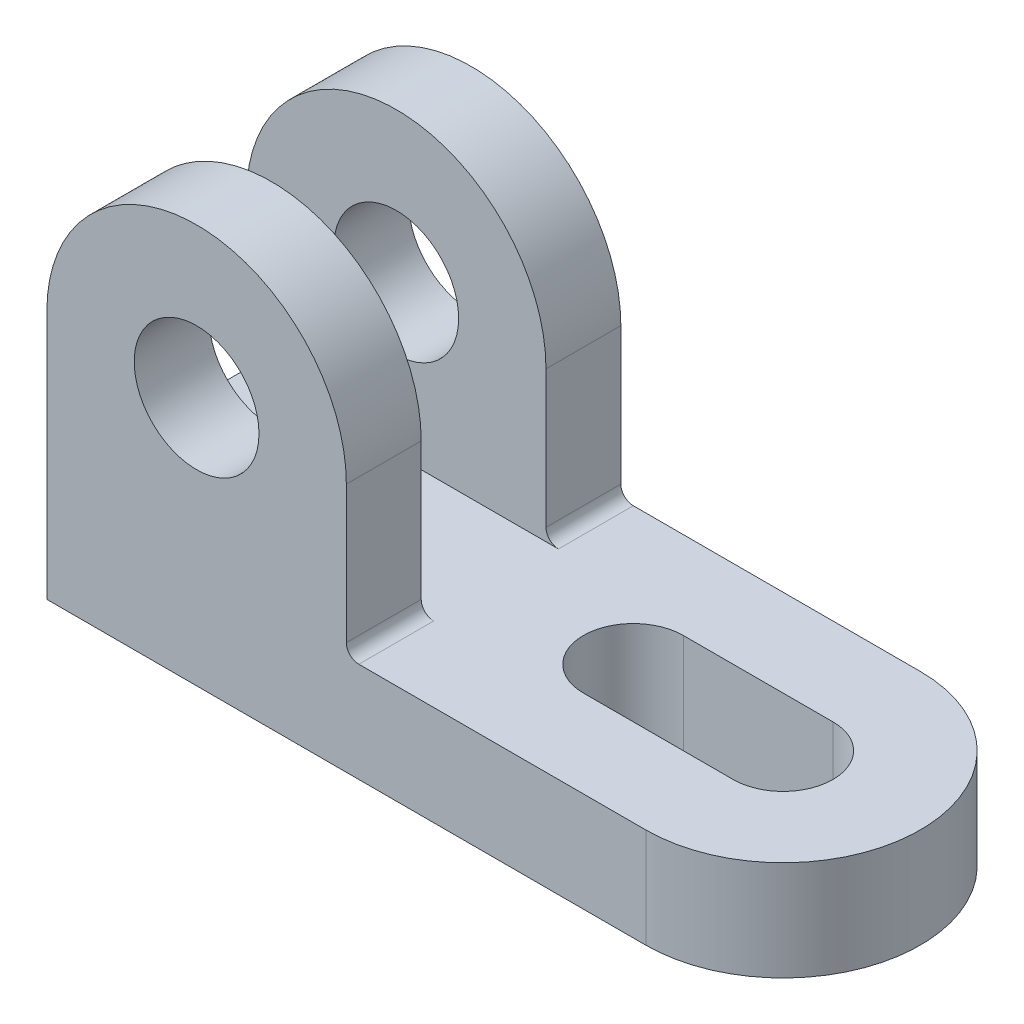
ISO-10303-21;
HEADER;
FILE_DESCRIPTION(('STEP AP214'),'2;1');
FILE_NAME('part.step','',(''),(''),'','','');
FILE_SCHEMA(('AUTOMOTIVE_DESIGN { 1 0 10303 214 1 1 1 1 }'));
ENDSEC;
DATA;
#1=APPLICATION_CONTEXT('core data for automotive mechanical design processes');
#2=APPLICATION_PROTOCOL_DEFINITION('international standard','automotive_design',2000,#1);
#3=PRODUCT_CONTEXT('',#1,'mechanical');
#4=PRODUCT('Part','Part','',(#3));
#5=PRODUCT_RELATED_PRODUCT_CATEGORY('part','',(#4));
#6=PRODUCT_DEFINITION_FORMATION('','',#4);
#7=PRODUCT_DEFINITION_CONTEXT('part definition',#1,'design');
#8=PRODUCT_DEFINITION('design','',#6,#7);
#9=PRODUCT_DEFINITION_SHAPE('','',#8);
#10=(LENGTH_UNIT() NAMED_UNIT(*) SI_UNIT(.MILLI.,.METRE.));
#11=(NAMED_UNIT(*) PLANE_ANGLE_UNIT() SI_UNIT($,.RADIAN.));
#12=(NAMED_UNIT(*) SI_UNIT($,.STERADIAN.) SOLID_ANGLE_UNIT());
#13=UNCERTAINTY_MEASURE_WITH_UNIT(LENGTH_MEASURE(1.E-05),#10,'distance_accuracy_value','');
#14=(GEOMETRIC_REPRESENTATION_CONTEXT(3) GLOBAL_UNCERTAINTY_ASSIGNED_CONTEXT((#13)) GLOBAL_UNIT_ASSIGNED_CONTEXT((#10,
#11,#12)) REPRESENTATION_CONTEXT('',''));
#15=CARTESIAN_POINT('',(0.,0.,0.));
#16=DIRECTION('',(0.,0.,1.));
#17=DIRECTION('',(1.,0.,0.));
#18=AXIS2_PLACEMENT_3D('',#15,#16,#17);
#19=CARTESIAN_POINT('',(0.,16.,0.));
#20=DIRECTION('',(0.,1.,0.));
#21=DIRECTION('',(0.,0.,1.));
#22=AXIS2_PLACEMENT_3D('',#19,#20,#21);
#23=PLANE('',#22);
#24=DIRECTION('',(-1.,0.,0.));
#25=VECTOR('',#24,1.);
#26=CARTESIAN_POINT('',(0.,16.,-7.99999999999996));
#27=LINE('',#26,#25);
#28=CARTESIAN_POINT('',(96.,16.,-8.00000000000001));
#29=VERTEX_POINT('',#28);
#30=CARTESIAN_POINT('',(72.,16.,-8.00000000000001));
#31=VERTEX_POINT('',#30);
#32=EDGE_CURVE('E250',#29,#31,#27,.T.);
#33=ORIENTED_EDGE('',*,*,#32,.F.);
#34=CARTESIAN_POINT('',(96.,16.,-5.06539254985228E-13));
#35=DIRECTION('',(0.,1.,0.));
#36=DIRECTION('',(0.,0.,1.));
#37=AXIS2_PLACEMENT_3D('',#34,#35,#36);
#38=CIRCLE('',#37,8.);
#39=CARTESIAN_POINT('',(96.,16.,7.99999999999998));
#40=VERTEX_POINT('',#39);
#41=EDGE_CURVE('E254',#29,#40,#38,.F.);
#42=ORIENTED_EDGE('',*,*,#41,.T.);
#43=DIRECTION('',(1.,0.,0.));
#44=VECTOR('',#43,1.);
#45=CARTESIAN_POINT('',(0.,16.,7.99999999999998));
#46=LINE('',#45,#44);
#47=CARTESIAN_POINT('',(72.,16.,7.99999999999998));
#48=VERTEX_POINT('',#47);
#49=EDGE_CURVE('E258',#48,#40,#46,.T.);
#50=ORIENTED_EDGE('',*,*,#49,.F.);
#51=CARTESIAN_POINT('',(72.,16.,0.));
#52=DIRECTION('',(0.,1.,0.));
#53=DIRECTION('',(0.,0.,1.));
#54=AXIS2_PLACEMENT_3D('',#51,#52,#53);
#55=CIRCLE('',#54,7.99999999999999);
#56=EDGE_CURVE('E262',#31,#48,#55,.T.);
#57=ORIENTED_EDGE('',*,*,#56,.F.);
#58=EDGE_LOOP('',(#33,#42,#50,#57));
#59=FACE_BOUND('',#58,.T.);
#60=DIRECTION('',(1.,0.,0.));
#61=VECTOR('',#60,1.);
#62=CARTESIAN_POINT('',(-2.29778580422095E-13,16.,-22.));
#63=LINE('',#62,#61);
#64=CARTESIAN_POINT('',(50.,16.,-22.0000000000005));
#65=VERTEX_POINT('',#64);
#66=CARTESIAN_POINT('',(96.,16.,-22.000000000001));
#67=VERTEX_POINT('',#66);
#68=EDGE_CURVE('E270',#65,#67,#63,.T.);
#69=ORIENTED_EDGE('',*,*,#68,.F.);
#70=DIRECTION('',(0.,0.,1.));
#71=VECTOR('',#70,1.);
#72=CARTESIAN_POINT('',(50.,16.,0.));
#73=LINE('',#72,#71);
#74=CARTESIAN_POINT('',(50.,16.,-10.));
#75=VERTEX_POINT('',#74);
#76=EDGE_CURVE('E335',#65,#75,#73,.T.);
#77=ORIENTED_EDGE('',*,*,#76,.T.);
#78=DIRECTION('',(1.,0.,0.));
#79=VECTOR('',#78,1.);
#80=CARTESIAN_POINT('',(0.,16.,-10.));
#81=LINE('',#80,#79);
#82=CARTESIAN_POINT('',(0.,16.,-10.));
#83=VERTEX_POINT('',#82);
#84=EDGE_CURVE('E209',#83,#75,#81,.T.);
#85=ORIENTED_EDGE('',*,*,#84,.F.);
#86=DIRECTION('',(0.,0.,-1.));
#87=VECTOR('',#86,1.);
#88=CARTESIAN_POINT('',(0.,16.,0.));
#89=LINE('',#88,#87);
#90=CARTESIAN_POINT('',(0.,16.,10.));
#91=VERTEX_POINT('',#90);
#92=EDGE_CURVE('E273',#91,#83,#89,.T.);
#93=ORIENTED_EDGE('',*,*,#92,.F.);
#94=DIRECTION('',(1.,0.,0.));
#95=VECTOR('',#94,1.);
#96=CARTESIAN_POINT('',(0.,16.,10.));
#97=LINE('',#96,#95);
#98=CARTESIAN_POINT('',(50.,16.,10.));
#99=VERTEX_POINT('',#98);
#100=EDGE_CURVE('E246',#91,#99,#97,.T.);
#101=ORIENTED_EDGE('',*,*,#100,.T.);
#102=DIRECTION('',(0.,0.,-1.));
#103=VECTOR('',#102,1.);
#104=CARTESIAN_POINT('',(50.,16.,22.));
#105=LINE('',#104,#103);
#106=CARTESIAN_POINT('',(50.,16.,22.));
#107=VERTEX_POINT('',#106);
#108=EDGE_CURVE('E322',#99,#107,#105,.F.);
#109=ORIENTED_EDGE('',*,*,#108,.T.);
#110=DIRECTION('',(-1.,0.,0.));
#111=VECTOR('',#110,1.);
#112=CARTESIAN_POINT('',(0.,16.,22.));
#113=LINE('',#112,#111);
#114=CARTESIAN_POINT('',(96.,16.,22.));
#115=VERTEX_POINT('',#114);
#116=EDGE_CURVE('E277',#115,#107,#113,.T.);
#117=ORIENTED_EDGE('',*,*,#116,.F.);
#118=CARTESIAN_POINT('',(96.,16.,-5.06539254985228E-13));
#119=DIRECTION('',(0.,1.,0.));
#120=DIRECTION('',(0.,0.,1.));
#121=AXIS2_PLACEMENT_3D('',#118,#119,#120);
#122=CIRCLE('',#121,22.0000000000005);
#123=EDGE_CURVE('E266',#67,#115,#122,.F.);
#124=ORIENTED_EDGE('',*,*,#123,.F.);
#125=EDGE_LOOP('',(#69,#77,#85,#93,#101,#109,#117,#124));
#126=FACE_BOUND('',#125,.T.);
#127=ADVANCED_FACE('F45',(#59,#126),#23,.T.);
#128=CARTESIAN_POINT('',(96.,16.,-5.06539254985228E-13));
#129=DIRECTION('',(0.,-1.,0.));
#130=DIRECTION('',(0.,0.,-1.));
#131=AXIS2_PLACEMENT_3D('',#128,#129,#130);
#132=CYLINDRICAL_SURFACE('',#131,22.0000000000005);
#133=CARTESIAN_POINT('',(96.,0.,-5.06539254985228E-13));
#134=DIRECTION('',(0.,1.,0.));
#135=DIRECTION('',(0.,0.,1.));
#136=AXIS2_PLACEMENT_3D('',#133,#134,#135);
#137=CIRCLE('',#136,22.0000000000005);
#138=CARTESIAN_POINT('',(96.,0.,-22.000000000001));
#139=VERTEX_POINT('',#138);
#140=CARTESIAN_POINT('',(96.,0.,22.));
#141=VERTEX_POINT('',#140);
#142=EDGE_CURVE('E296',#139,#141,#137,.F.);
#143=ORIENTED_EDGE('',*,*,#142,.F.);
#144=DIRECTION('',(0.,-1.,0.));
#145=VECTOR('',#144,1.);
#146=CARTESIAN_POINT('',(96.,16.,-22.000000000001));
#147=LINE('',#146,#145);
#148=EDGE_CURVE('E318',#67,#139,#147,.T.);
#149=ORIENTED_EDGE('',*,*,#148,.F.);
#150=ORIENTED_EDGE('',*,*,#123,.T.);
#151=DIRECTION('',(0.,-1.,0.));
#152=VECTOR('',#151,1.);
#153=CARTESIAN_POINT('',(96.,16.,22.));
#154=LINE('',#153,#152);
#155=EDGE_CURVE('E308',#115,#141,#154,.T.);
#156=ORIENTED_EDGE('',*,*,#155,.T.);
#157=EDGE_LOOP('',(#143,#149,#150,#156));
#158=FACE_BOUND('',#157,.T.);
#159=ADVANCED_FACE('F366',(#158),#132,.T.);
#160=CARTESIAN_POINT('',(-2.29778580422095E-13,16.,-22.));
#161=DIRECTION('',(0.,0.,-1.));
#162=DIRECTION('',(-1.,0.,0.));
#163=AXIS2_PLACEMENT_3D('',#160,#161,#162);
#164=PLANE('',#163);
#165=DIRECTION('',(0.,-1.,0.));
#166=VECTOR('',#165,1.);
#167=CARTESIAN_POINT('',(48.,0.,-22.));
#168=LINE('',#167,#166);
#169=CARTESIAN_POINT('',(48.,40.,-22.));
#170=VERTEX_POINT('',#169);
#171=CARTESIAN_POINT('',(48.,18.,-22.));
#172=VERTEX_POINT('',#171);
#173=EDGE_CURVE('E165',#170,#172,#168,.T.);
#174=ORIENTED_EDGE('',*,*,#173,.T.);
#175=CARTESIAN_POINT('',(50.,18.,-22.0000000000005));
#176=DIRECTION('',(0.,0.,-1.));
#177=DIRECTION('',(-1.,0.,0.));
#178=AXIS2_PLACEMENT_3D('',#175,#176,#177);
#179=CIRCLE('',#178,2.);
#180=EDGE_CURVE('E347',#172,#65,#179,.F.);
#181=ORIENTED_EDGE('',*,*,#180,.T.);
#182=ORIENTED_EDGE('',*,*,#68,.T.);
#183=ORIENTED_EDGE('',*,*,#148,.T.);
#184=DIRECTION('',(1.,0.,0.));
#185=VECTOR('',#184,1.);
#186=CARTESIAN_POINT('',(-2.29778580422095E-13,0.,-22.));
#187=LINE('',#186,#185);
#188=CARTESIAN_POINT('',(0.,0.,-22.));
#189=VERTEX_POINT('',#188);
#190=EDGE_CURVE('E300',#189,#139,#187,.T.);
#191=ORIENTED_EDGE('',*,*,#190,.F.);
#192=DIRECTION('',(0.,-1.,0.));
#193=VECTOR('',#192,1.);
#194=CARTESIAN_POINT('',(0.,16.,-22.));
#195=LINE('',#194,#193);
#196=CARTESIAN_POINT('',(0.,40.,-22.));
#197=VERTEX_POINT('',#196);
#198=EDGE_CURVE('E169',#197,#189,#195,.T.);
#199=ORIENTED_EDGE('',*,*,#198,.F.);
#200=CARTESIAN_POINT('',(24.,40.,-22.));
#201=DIRECTION('',(0.,0.,1.));
#202=DIRECTION('',(1.,0.,0.));
#203=AXIS2_PLACEMENT_3D('',#200,#201,#202);
#204=CIRCLE('',#203,24.);
#205=EDGE_CURVE('E160',#197,#170,#204,.F.);
#206=ORIENTED_EDGE('',*,*,#205,.T.);
#207=EDGE_LOOP('',(#174,#181,#182,#183,#191,#199,#206));
#208=FACE_BOUND('',#207,.T.);
#209=CARTESIAN_POINT('',(24.,40.,-22.));
#210=DIRECTION('',(0.,0.,1.));
#211=DIRECTION('',(1.,0.,0.));
#212=AXIS2_PLACEMENT_3D('',#209,#210,#211);
#213=CIRCLE('',#212,10.);
#214=CARTESIAN_POINT('',(34.,40.,-22.));
#215=VERTEX_POINT('',#214);
#216=EDGE_CURVE('E174',#215,#215,#213,.T.);
#217=ORIENTED_EDGE('',*,*,#216,.T.);
#218=EDGE_LOOP('',(#217));
#219=FACE_BOUND('',#218,.T.);
#220=ADVANCED_FACE('F162',(#208,#219),#164,.T.);
#221=CARTESIAN_POINT('',(0.,16.,0.));
#222=DIRECTION('',(-1.,0.,0.));
#223=DIRECTION('',(0.,0.,1.));
#224=AXIS2_PLACEMENT_3D('',#221,#222,#223);
#225=PLANE('',#224);
#226=ORIENTED_EDGE('',*,*,#92,.T.);
#227=DIRECTION('',(0.,1.,0.));
#228=VECTOR('',#227,1.);
#229=CARTESIAN_POINT('',(0.,0.,-10.));
#230=LINE('',#229,#228);
#231=CARTESIAN_POINT('',(0.,40.,-10.));
#232=VERTEX_POINT('',#231);
#233=EDGE_CURVE('E195',#83,#232,#230,.T.);
#234=ORIENTED_EDGE('',*,*,#233,.T.);
#235=DIRECTION('',(0.,0.,1.));
#236=VECTOR('',#235,1.);
#237=CARTESIAN_POINT('',(0.,40.,-22.));
#238=LINE('',#237,#236);
#239=EDGE_CURVE('E185',#197,#232,#238,.T.);
#240=ORIENTED_EDGE('',*,*,#239,.F.);
#241=ORIENTED_EDGE('',*,*,#198,.T.);
#242=DIRECTION('',(0.,0.,-1.));
#243=VECTOR('',#242,1.);
#244=CARTESIAN_POINT('',(0.,0.,0.));
#245=LINE('',#244,#243);
#246=CARTESIAN_POINT('',(0.,0.,22.));
#247=VERTEX_POINT('',#246);
#248=EDGE_CURVE('E303',#247,#189,#245,.T.);
#249=ORIENTED_EDGE('',*,*,#248,.F.);
#250=DIRECTION('',(0.,-1.,0.));
#251=VECTOR('',#250,1.);
#252=CARTESIAN_POINT('',(0.,16.,22.));
#253=LINE('',#252,#251);
#254=CARTESIAN_POINT('',(0.,40.,22.));
#255=VERTEX_POINT('',#254);
#256=EDGE_CURVE('E311',#255,#247,#253,.T.);
#257=ORIENTED_EDGE('',*,*,#256,.F.);
#258=DIRECTION('',(0.,0.,-1.));
#259=VECTOR('',#258,1.);
#260=CARTESIAN_POINT('',(0.,40.,22.));
#261=LINE('',#260,#259);
#262=CARTESIAN_POINT('',(0.,40.,10.));
#263=VERTEX_POINT('',#262);
#264=EDGE_CURVE('E226',#255,#263,#261,.T.);
#265=ORIENTED_EDGE('',*,*,#264,.T.);
#266=DIRECTION('',(0.,1.,0.));
#267=VECTOR('',#266,1.);
#268=CARTESIAN_POINT('',(0.,0.,10.));
#269=LINE('',#268,#267);
#270=EDGE_CURVE('E234',#91,#263,#269,.T.);
#271=ORIENTED_EDGE('',*,*,#270,.F.);
#272=EDGE_LOOP('',(#226,#234,#240,#241,#249,#257,#265,#271));
#273=FACE_BOUND('',#272,.T.);
#274=ADVANCED_FACE('F376',(#273),#225,.T.);
#275=CARTESIAN_POINT('',(0.,16.,-7.99999999999996));
#276=DIRECTION('',(0.,0.,1.));
#277=DIRECTION('',(1.,0.,0.));
#278=AXIS2_PLACEMENT_3D('',#275,#276,#277);
#279=PLANE('',#278);
#280=DIRECTION('',(-1.,0.,0.));
#281=VECTOR('',#280,1.);
#282=CARTESIAN_POINT('',(0.,0.,-7.99999999999996));
#283=LINE('',#282,#281);
#284=CARTESIAN_POINT('',(96.,0.,-8.00000000000001));
#285=VERTEX_POINT('',#284);
#286=CARTESIAN_POINT('',(72.,0.,-8.00000000000001));
#287=VERTEX_POINT('',#286);
#288=EDGE_CURVE('E249',#285,#287,#283,.T.);
#289=ORIENTED_EDGE('',*,*,#288,.F.);
#290=DIRECTION('',(0.,-1.,0.));
#291=VECTOR('',#290,1.);
#292=CARTESIAN_POINT('',(96.,16.,-8.00000000000001));
#293=LINE('',#292,#291);
#294=EDGE_CURVE('E312',#29,#285,#293,.T.);
#295=ORIENTED_EDGE('',*,*,#294,.F.);
#296=ORIENTED_EDGE('',*,*,#32,.T.);
#297=DIRECTION('',(0.,-1.,0.));
#298=VECTOR('',#297,1.);
#299=CARTESIAN_POINT('',(72.,16.,-8.00000000000001));
#300=LINE('',#299,#298);
#301=EDGE_CURVE('E280',#31,#287,#300,.T.);
#302=ORIENTED_EDGE('',*,*,#301,.T.);
#303=EDGE_LOOP('',(#289,#295,#296,#302));
#304=FACE_BOUND('',#303,.T.);
#305=ADVANCED_FACE('F406',(#304),#279,.T.);
#306=CARTESIAN_POINT('',(96.,16.,-5.06539254985228E-13));
#307=DIRECTION('',(0.,-1.,0.));
#308=DIRECTION('',(0.,0.,-1.));
#309=AXIS2_PLACEMENT_3D('',#306,#307,#308);
#310=CYLINDRICAL_SURFACE('',#309,8.);
#311=CARTESIAN_POINT('',(96.,0.,-5.06539254985228E-13));
#312=DIRECTION('',(0.,1.,0.));
#313=DIRECTION('',(0.,0.,1.));
#314=AXIS2_PLACEMENT_3D('',#311,#312,#313);
#315=CIRCLE('',#314,8.);
#316=CARTESIAN_POINT('',(96.,0.,7.99999999999998));
#317=VERTEX_POINT('',#316);
#318=EDGE_CURVE('E284',#285,#317,#315,.F.);
#319=ORIENTED_EDGE('',*,*,#318,.T.);
#320=DIRECTION('',(0.,-1.,0.));
#321=VECTOR('',#320,1.);
#322=CARTESIAN_POINT('',(96.,16.,7.99999999999998));
#323=LINE('',#322,#321);
#324=EDGE_CURVE('E328',#40,#317,#323,.T.);
#325=ORIENTED_EDGE('',*,*,#324,.F.);
#326=ORIENTED_EDGE('',*,*,#41,.F.);
#327=ORIENTED_EDGE('',*,*,#294,.T.);
#328=EDGE_LOOP('',(#319,#325,#326,#327));
#329=FACE_BOUND('',#328,.T.);
#330=ADVANCED_FACE('F404',(#329),#310,.F.);
#331=CARTESIAN_POINT('',(0.,16.,7.99999999999998));
#332=DIRECTION('',(0.,0.,-1.));
#333=DIRECTION('',(-1.,0.,0.));
#334=AXIS2_PLACEMENT_3D('',#331,#332,#333);
#335=PLANE('',#334);
#336=DIRECTION('',(1.,0.,0.));
#337=VECTOR('',#336,1.);
#338=CARTESIAN_POINT('',(0.,0.,7.99999999999998));
#339=LINE('',#338,#337);
#340=CARTESIAN_POINT('',(72.,0.,7.99999999999998));
#341=VERTEX_POINT('',#340);
#342=EDGE_CURVE('E288',#341,#317,#339,.T.);
#343=ORIENTED_EDGE('',*,*,#342,.F.);
#344=DIRECTION('',(0.,-1.,0.));
#345=VECTOR('',#344,1.);
#346=CARTESIAN_POINT('',(72.,16.,7.99999999999998));
#347=LINE('',#346,#345);
#348=EDGE_CURVE('E325',#48,#341,#347,.T.);
#349=ORIENTED_EDGE('',*,*,#348,.F.);
#350=ORIENTED_EDGE('',*,*,#49,.T.);
#351=ORIENTED_EDGE('',*,*,#324,.T.);
#352=EDGE_LOOP('',(#343,#349,#350,#351));
#353=FACE_BOUND('',#352,.T.);
#354=ADVANCED_FACE('F400',(#353),#335,.T.);
#355=CARTESIAN_POINT('',(72.,16.,0.));
#356=DIRECTION('',(0.,-1.,0.));
#357=DIRECTION('',(0.,0.,-1.));
#358=AXIS2_PLACEMENT_3D('',#355,#356,#357);
#359=CYLINDRICAL_SURFACE('',#358,7.99999999999999);
#360=CARTESIAN_POINT('',(72.,0.,0.));
#361=DIRECTION('',(0.,1.,0.));
#362=DIRECTION('',(0.,0.,1.));
#363=AXIS2_PLACEMENT_3D('',#360,#361,#362);
#364=CIRCLE('',#363,7.99999999999999);
#365=EDGE_CURVE('E292',#287,#341,#364,.T.);
#366=ORIENTED_EDGE('',*,*,#365,.F.);
#367=ORIENTED_EDGE('',*,*,#301,.F.);
#368=ORIENTED_EDGE('',*,*,#56,.T.);
#369=ORIENTED_EDGE('',*,*,#348,.T.);
#370=EDGE_LOOP('',(#366,#367,#368,#369));
#371=FACE_BOUND('',#370,.T.);
#372=ADVANCED_FACE('F395',(#371),#359,.F.);
#373=CARTESIAN_POINT('',(0.,16.,22.));
#374=DIRECTION('',(0.,0.,1.));
#375=DIRECTION('',(1.,0.,0.));
#376=AXIS2_PLACEMENT_3D('',#373,#374,#375);
#377=PLANE('',#376);
#378=ORIENTED_EDGE('',*,*,#116,.T.);
#379=CARTESIAN_POINT('',(50.,18.,22.));
#380=DIRECTION('',(0.,0.,1.));
#381=DIRECTION('',(1.,0.,0.));
#382=AXIS2_PLACEMENT_3D('',#379,#380,#381);
#383=CIRCLE('',#382,2.);
#384=CARTESIAN_POINT('',(48.,18.,22.));
#385=VERTEX_POINT('',#384);
#386=EDGE_CURVE('E11',#107,#385,#383,.F.);
#387=ORIENTED_EDGE('',*,*,#386,.T.);
#388=DIRECTION('',(0.,-1.,0.));
#389=VECTOR('',#388,1.);
#390=CARTESIAN_POINT('',(48.,0.,22.));
#391=LINE('',#390,#389);
#392=CARTESIAN_POINT('',(48.,40.,22.));
#393=VERTEX_POINT('',#392);
#394=EDGE_CURVE('E214',#393,#385,#391,.T.);
#395=ORIENTED_EDGE('',*,*,#394,.F.);
#396=CARTESIAN_POINT('',(24.,40.,22.));
#397=DIRECTION('',(0.,0.,1.));
#398=DIRECTION('',(1.,0.,0.));
#399=AXIS2_PLACEMENT_3D('',#396,#397,#398);
#400=CIRCLE('',#399,24.);
#401=EDGE_CURVE('E217',#255,#393,#400,.F.);
#402=ORIENTED_EDGE('',*,*,#401,.F.);
#403=ORIENTED_EDGE('',*,*,#256,.T.);
#404=DIRECTION('',(-1.,0.,0.));
#405=VECTOR('',#404,1.);
#406=CARTESIAN_POINT('',(0.,0.,22.));
#407=LINE('',#406,#405);
#408=EDGE_CURVE('E255',#141,#247,#407,.T.);
#409=ORIENTED_EDGE('',*,*,#408,.F.);
#410=ORIENTED_EDGE('',*,*,#155,.F.);
#411=EDGE_LOOP('',(#378,#387,#395,#402,#403,#409,#410));
#412=FACE_BOUND('',#411,.T.);
#413=CARTESIAN_POINT('',(24.,40.,22.));
#414=DIRECTION('',(0.,0.,1.));
#415=DIRECTION('',(1.,0.,0.));
#416=AXIS2_PLACEMENT_3D('',#413,#414,#415);
#417=CIRCLE('',#416,10.);
#418=CARTESIAN_POINT('',(34.,40.,22.));
#419=VERTEX_POINT('',#418);
#420=EDGE_CURVE('E222',#419,#419,#417,.T.);
#421=ORIENTED_EDGE('',*,*,#420,.F.);
#422=EDGE_LOOP('',(#421));
#423=FACE_BOUND('',#422,.T.);
#424=ADVANCED_FACE('F360',(#412,#423),#377,.T.);
#425=CARTESIAN_POINT('',(0.,0.,0.));
#426=DIRECTION('',(0.,1.,0.));
#427=DIRECTION('',(0.,0.,1.));
#428=AXIS2_PLACEMENT_3D('',#425,#426,#427);
#429=PLANE('',#428);
#430=ORIENTED_EDGE('',*,*,#190,.T.);
#431=ORIENTED_EDGE('',*,*,#142,.T.);
#432=ORIENTED_EDGE('',*,*,#408,.T.);
#433=ORIENTED_EDGE('',*,*,#248,.T.);
#434=EDGE_LOOP('',(#430,#431,#432,#433));
#435=FACE_BOUND('',#434,.T.);
#436=ORIENTED_EDGE('',*,*,#288,.T.);
#437=ORIENTED_EDGE('',*,*,#365,.T.);
#438=ORIENTED_EDGE('',*,*,#342,.T.);
#439=ORIENTED_EDGE('',*,*,#318,.F.);
#440=EDGE_LOOP('',(#436,#437,#438,#439));
#441=FACE_BOUND('',#440,.T.);
#442=ADVANCED_FACE('F386',(#435,#441),#429,.F.);
#443=CARTESIAN_POINT('',(48.,0.,22.));
#444=DIRECTION('',(1.,0.,0.));
#445=DIRECTION('',(0.,1.,0.));
#446=AXIS2_PLACEMENT_3D('',#443,#444,#445);
#447=PLANE('',#446);
#448=ORIENTED_EDGE('',*,*,#394,.T.);
#449=DIRECTION('',(0.,0.,-1.));
#450=VECTOR('',#449,1.);
#451=CARTESIAN_POINT('',(48.,18.,10.));
#452=LINE('',#451,#450);
#453=CARTESIAN_POINT('',(48.,18.,10.));
#454=VERTEX_POINT('',#453);
#455=EDGE_CURVE('E341',#385,#454,#452,.T.);
#456=ORIENTED_EDGE('',*,*,#455,.T.);
#457=DIRECTION('',(0.,-1.,0.));
#458=VECTOR('',#457,1.);
#459=CARTESIAN_POINT('',(48.,0.,10.));
#460=LINE('',#459,#458);
#461=CARTESIAN_POINT('',(48.,40.,10.));
#462=VERTEX_POINT('',#461);
#463=EDGE_CURVE('E213',#462,#454,#460,.T.);
#464=ORIENTED_EDGE('',*,*,#463,.F.);
#465=DIRECTION('',(0.,0.,-1.));
#466=VECTOR('',#465,1.);
#467=CARTESIAN_POINT('',(48.,40.,22.));
#468=LINE('',#467,#466);
#469=EDGE_CURVE('E243',#393,#462,#468,.T.);
#470=ORIENTED_EDGE('',*,*,#469,.F.);
#471=EDGE_LOOP('',(#448,#456,#464,#470));
#472=FACE_BOUND('',#471,.T.);
#473=ADVANCED_FACE('F383',(#472),#447,.T.);
#474=CARTESIAN_POINT('',(24.,40.,22.));
#475=DIRECTION('',(0.,0.,-1.));
#476=DIRECTION('',(-1.,0.,0.));
#477=AXIS2_PLACEMENT_3D('',#474,#475,#476);
#478=CYLINDRICAL_SURFACE('',#477,24.);
#479=CARTESIAN_POINT('',(24.,40.,10.));
#480=DIRECTION('',(0.,0.,1.));
#481=DIRECTION('',(1.,0.,0.));
#482=AXIS2_PLACEMENT_3D('',#479,#480,#481);
#483=CIRCLE('',#482,24.);
#484=EDGE_CURVE('E230',#263,#462,#483,.F.);
#485=ORIENTED_EDGE('',*,*,#484,.F.);
#486=ORIENTED_EDGE('',*,*,#264,.F.);
#487=ORIENTED_EDGE('',*,*,#401,.T.);
#488=ORIENTED_EDGE('',*,*,#469,.T.);
#489=EDGE_LOOP('',(#485,#486,#487,#488));
#490=FACE_BOUND('',#489,.T.);
#491=ADVANCED_FACE('F380',(#490),#478,.T.);
#492=CARTESIAN_POINT('',(24.,40.,22.));
#493=DIRECTION('',(0.,0.,-1.));
#494=DIRECTION('',(-1.,0.,0.));
#495=AXIS2_PLACEMENT_3D('',#492,#493,#494);
#496=CYLINDRICAL_SURFACE('',#495,10.);
#497=ORIENTED_EDGE('',*,*,#420,.T.);
#498=EDGE_LOOP('',(#497));
#499=FACE_BOUND('',#498,.T.);
#500=CARTESIAN_POINT('',(24.,40.,10.));
#501=DIRECTION('',(0.,0.,1.));
#502=DIRECTION('',(1.,0.,0.));
#503=AXIS2_PLACEMENT_3D('',#500,#501,#502);
#504=CIRCLE('',#503,10.);
#505=CARTESIAN_POINT('',(34.,40.,10.));
#506=VERTEX_POINT('',#505);
#507=EDGE_CURVE('E218',#506,#506,#504,.T.);
#508=ORIENTED_EDGE('',*,*,#507,.F.);
#509=EDGE_LOOP('',(#508));
#510=FACE_BOUND('',#509,.T.);
#511=ADVANCED_FACE('F449',(#499,#510),#496,.F.);
#512=CARTESIAN_POINT('',(0.,0.,10.));
#513=DIRECTION('',(0.,0.,1.));
#514=DIRECTION('',(1.,0.,0.));
#515=AXIS2_PLACEMENT_3D('',#512,#513,#514);
#516=PLANE('',#515);
#517=ORIENTED_EDGE('',*,*,#100,.F.);
#518=ORIENTED_EDGE('',*,*,#270,.T.);
#519=ORIENTED_EDGE('',*,*,#484,.T.);
#520=ORIENTED_EDGE('',*,*,#463,.T.);
#521=CARTESIAN_POINT('',(50.,18.,10.));
#522=DIRECTION('',(0.,0.,1.));
#523=DIRECTION('',(1.,0.,0.));
#524=AXIS2_PLACEMENT_3D('',#521,#522,#523);
#525=CIRCLE('',#524,2.);
#526=EDGE_CURVE('E54',#454,#99,#525,.T.);
#527=ORIENTED_EDGE('',*,*,#526,.T.);
#528=EDGE_LOOP('',(#517,#518,#519,#520,#527));
#529=FACE_BOUND('',#528,.T.);
#530=ORIENTED_EDGE('',*,*,#507,.T.);
#531=EDGE_LOOP('',(#530));
#532=FACE_BOUND('',#531,.T.);
#533=ADVANCED_FACE('F351',(#529,#532),#516,.F.);
#534=CARTESIAN_POINT('',(48.,0.,-22.));
#535=DIRECTION('',(-1.,0.,0.));
#536=DIRECTION('',(0.,-1.,0.));
#537=AXIS2_PLACEMENT_3D('',#534,#535,#536);
#538=PLANE('',#537);
#539=DIRECTION('',(0.,-1.,0.));
#540=VECTOR('',#539,1.);
#541=CARTESIAN_POINT('',(48.,0.,-10.));
#542=LINE('',#541,#540);
#543=CARTESIAN_POINT('',(48.,40.,-10.));
#544=VERTEX_POINT('',#543);
#545=CARTESIAN_POINT('',(48.,18.,-10.));
#546=VERTEX_POINT('',#545);
#547=EDGE_CURVE('E201',#544,#546,#542,.T.);
#548=ORIENTED_EDGE('',*,*,#547,.T.);
#549=DIRECTION('',(0.,0.,1.));
#550=VECTOR('',#549,1.);
#551=CARTESIAN_POINT('',(48.,18.,-22.));
#552=LINE('',#551,#550);
#553=EDGE_CURVE('E189',#546,#172,#552,.F.);
#554=ORIENTED_EDGE('',*,*,#553,.T.);
#555=ORIENTED_EDGE('',*,*,#173,.F.);
#556=DIRECTION('',(0.,0.,1.));
#557=VECTOR('',#556,1.);
#558=CARTESIAN_POINT('',(48.,40.,-22.));
#559=LINE('',#558,#557);
#560=EDGE_CURVE('E177',#170,#544,#559,.T.);
#561=ORIENTED_EDGE('',*,*,#560,.T.);
#562=EDGE_LOOP('',(#548,#554,#555,#561));
#563=FACE_BOUND('',#562,.T.);
#564=ADVANCED_FACE('F187',(#563),#538,.F.);
#565=CARTESIAN_POINT('',(24.,40.,-22.));
#566=DIRECTION('',(0.,0.,1.));
#567=DIRECTION('',(1.,0.,0.));
#568=AXIS2_PLACEMENT_3D('',#565,#566,#567);
#569=CYLINDRICAL_SURFACE('',#568,24.);
#570=CARTESIAN_POINT('',(24.,40.,-10.));
#571=DIRECTION('',(0.,0.,1.));
#572=DIRECTION('',(1.,0.,0.));
#573=AXIS2_PLACEMENT_3D('',#570,#571,#572);
#574=CIRCLE('',#573,24.);
#575=EDGE_CURVE('E180',#232,#544,#574,.F.);
#576=ORIENTED_EDGE('',*,*,#575,.T.);
#577=ORIENTED_EDGE('',*,*,#560,.F.);
#578=ORIENTED_EDGE('',*,*,#205,.F.);
#579=ORIENTED_EDGE('',*,*,#239,.T.);
#580=EDGE_LOOP('',(#576,#577,#578,#579));
#581=FACE_BOUND('',#580,.T.);
#582=ADVANCED_FACE('F178',(#581),#569,.T.);
#583=CARTESIAN_POINT('',(24.,40.,-22.));
#584=DIRECTION('',(0.,0.,1.));
#585=DIRECTION('',(1.,0.,0.));
#586=AXIS2_PLACEMENT_3D('',#583,#584,#585);
#587=CYLINDRICAL_SURFACE('',#586,10.);
#588=ORIENTED_EDGE('',*,*,#216,.F.);
#589=EDGE_LOOP('',(#588));
#590=FACE_BOUND('',#589,.T.);
#591=CARTESIAN_POINT('',(24.,40.,-10.));
#592=DIRECTION('',(0.,0.,1.));
#593=DIRECTION('',(1.,0.,0.));
#594=AXIS2_PLACEMENT_3D('',#591,#592,#593);
#595=CIRCLE('',#594,10.);
#596=CARTESIAN_POINT('',(34.,40.,-10.));
#597=VERTEX_POINT('',#596);
#598=EDGE_CURVE('E191',#597,#597,#595,.T.);
#599=ORIENTED_EDGE('',*,*,#598,.T.);
#600=EDGE_LOOP('',(#599));
#601=FACE_BOUND('',#600,.T.);
#602=ADVANCED_FACE('F435',(#590,#601),#587,.F.);
#603=CARTESIAN_POINT('',(0.,0.,-10.));
#604=DIRECTION('',(0.,0.,1.));
#605=DIRECTION('',(1.,0.,0.));
#606=AXIS2_PLACEMENT_3D('',#603,#604,#605);
#607=PLANE('',#606);
#608=ORIENTED_EDGE('',*,*,#233,.F.);
#609=ORIENTED_EDGE('',*,*,#84,.T.);
#610=CARTESIAN_POINT('',(50.,18.,-10.));
#611=DIRECTION('',(0.,0.,1.));
#612=DIRECTION('',(1.,0.,0.));
#613=AXIS2_PLACEMENT_3D('',#610,#611,#612);
#614=CIRCLE('',#613,2.);
#615=EDGE_CURVE('E344',#75,#546,#614,.F.);
#616=ORIENTED_EDGE('',*,*,#615,.T.);
#617=ORIENTED_EDGE('',*,*,#547,.F.);
#618=ORIENTED_EDGE('',*,*,#575,.F.);
#619=EDGE_LOOP('',(#608,#609,#616,#617,#618));
#620=FACE_BOUND('',#619,.T.);
#621=ORIENTED_EDGE('',*,*,#598,.F.);
#622=EDGE_LOOP('',(#621));
#623=FACE_BOUND('',#622,.T.);
#624=ADVANCED_FACE('F373',(#620,#623),#607,.T.);
#625=CARTESIAN_POINT('',(50.,18.,0.));
#626=DIRECTION('',(0.,0.,1.));
#627=DIRECTION('',(1.,0.,0.));
#628=AXIS2_PLACEMENT_3D('',#625,#626,#627);
#629=CYLINDRICAL_SURFACE('',#628,2.);
#630=ORIENTED_EDGE('',*,*,#180,.F.);
#631=ORIENTED_EDGE('',*,*,#553,.F.);
#632=ORIENTED_EDGE('',*,*,#615,.F.);
#633=ORIENTED_EDGE('',*,*,#76,.F.);
#634=EDGE_LOOP('',(#630,#631,#632,#633));
#635=FACE_BOUND('',#634,.T.);
#636=ADVANCED_FACE('F370',(#635),#629,.F.);
#637=CARTESIAN_POINT('',(50.,18.,22.));
#638=DIRECTION('',(0.,0.,1.));
#639=DIRECTION('',(1.,0.,0.));
#640=AXIS2_PLACEMENT_3D('',#637,#638,#639);
#641=CYLINDRICAL_SURFACE('',#640,2.);
#642=ORIENTED_EDGE('',*,*,#386,.F.);
#643=ORIENTED_EDGE('',*,*,#108,.F.);
#644=ORIENTED_EDGE('',*,*,#526,.F.);
#645=ORIENTED_EDGE('',*,*,#455,.F.);
#646=EDGE_LOOP('',(#642,#643,#644,#645));
#647=FACE_BOUND('',#646,.T.);
#648=ADVANCED_FACE('F47',(#647),#641,.F.);
#649=CLOSED_SHELL('',(#127,#159,#220,#274,#305,#330,#354,#372,#424,#442,#473,#491,#511,#533,
#564,#582,#602,#624,#636,#648));
#650=MANIFOLD_SOLID_BREP('B2',#649);
#651=ADVANCED_BREP_SHAPE_REPRESENTATION('',(#18,#650),#14);
#652=SHAPE_DEFINITION_REPRESENTATION(#9,#651);
ENDSEC;
END-ISO-10303-21;
